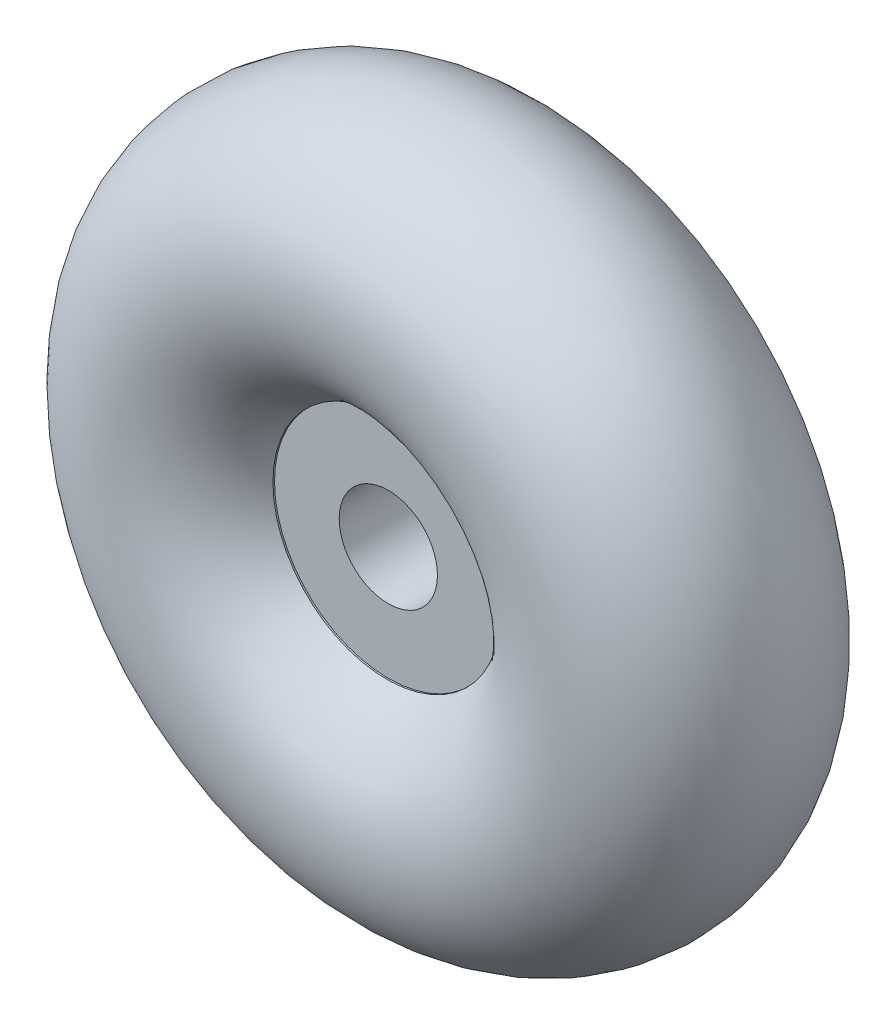
ISO-10303-21;
HEADER;
FILE_DESCRIPTION(('STEP AP214'),'2;1');
FILE_NAME('part.step','',(''),(''),'','','');
FILE_SCHEMA(('AUTOMOTIVE_DESIGN { 1 0 10303 214 1 1 1 1 }'));
ENDSEC;
DATA;
#1=APPLICATION_CONTEXT('core data for automotive mechanical design processes');
#2=APPLICATION_PROTOCOL_DEFINITION('international standard','automotive_design',2000,#1);
#3=PRODUCT_CONTEXT('',#1,'mechanical');
#4=PRODUCT('Part','Part','',(#3));
#5=PRODUCT_RELATED_PRODUCT_CATEGORY('part','',(#4));
#6=PRODUCT_DEFINITION_FORMATION('','',#4);
#7=PRODUCT_DEFINITION_CONTEXT('part definition',#1,'design');
#8=PRODUCT_DEFINITION('design','',#6,#7);
#9=PRODUCT_DEFINITION_SHAPE('','',#8);
#10=(LENGTH_UNIT() NAMED_UNIT(*) SI_UNIT(.MILLI.,.METRE.));
#11=(NAMED_UNIT(*) PLANE_ANGLE_UNIT() SI_UNIT($,.RADIAN.));
#12=(NAMED_UNIT(*) SI_UNIT($,.STERADIAN.) SOLID_ANGLE_UNIT());
#13=UNCERTAINTY_MEASURE_WITH_UNIT(LENGTH_MEASURE(1.E-05),#10,'distance_accuracy_value','');
#14=(GEOMETRIC_REPRESENTATION_CONTEXT(3) GLOBAL_UNCERTAINTY_ASSIGNED_CONTEXT((#13)) GLOBAL_UNIT_ASSIGNED_CONTEXT((#10,
#11,#12)) REPRESENTATION_CONTEXT('',''));
#15=CARTESIAN_POINT('',(0.,0.,0.));
#16=DIRECTION('',(0.,0.,1.));
#17=DIRECTION('',(1.,0.,0.));
#18=AXIS2_PLACEMENT_3D('',#15,#16,#17);
#19=CARTESIAN_POINT('',(0.,0.,0.));
#20=DIRECTION('',(0.,0.,-1.));
#21=DIRECTION('',(-1.,0.,0.));
#22=AXIS2_PLACEMENT_3D('',#19,#20,#21);
#23=CYLINDRICAL_SURFACE('',#22,9.5);
#24=CARTESIAN_POINT('',(0.,0.,-0.132226218918615));
#25=DIRECTION('',(0.,0.,-1.));
#26=DIRECTION('',(-1.,0.,0.));
#27=AXIS2_PLACEMENT_3D('',#24,#25,#26);
#28=CIRCLE('',#27,9.5);
#29=CARTESIAN_POINT('',(-9.5,0.,-0.132226218918615));
#30=VERTEX_POINT('',#29);
#31=EDGE_CURVE('E49',#30,#30,#28,.T.);
#32=ORIENTED_EDGE('',*,*,#31,.T.);
#33=EDGE_LOOP('',(#32));
#34=FACE_BOUND('',#33,.T.);
#35=CARTESIAN_POINT('',(0.,0.,0.));
#36=DIRECTION('',(0.,0.,1.));
#37=DIRECTION('',(1.,0.,0.));
#38=AXIS2_PLACEMENT_3D('',#35,#36,#37);
#39=CIRCLE('',#38,9.5);
#40=CARTESIAN_POINT('',(9.5,0.,0.));
#41=VERTEX_POINT('',#40);
#42=EDGE_CURVE('E10',#41,#41,#39,.T.);
#43=ORIENTED_EDGE('',*,*,#42,.T.);
#44=EDGE_LOOP('',(#43));
#45=FACE_BOUND('',#44,.T.);
#46=ADVANCED_FACE('F32',(#34,#45),#23,.F.);
#47=CARTESIAN_POINT('',(0.,0.,10.));
#48=DIRECTION('',(0.,0.,1.));
#49=DIRECTION('',(1.,0.,0.));
#50=AXIS2_PLACEMENT_3D('',#47,#48,#49);
#51=CIRCLE('',#50,9.5);
#52=CARTESIAN_POINT('',(9.5,0.,10.));
#53=VERTEX_POINT('',#52);
#54=EDGE_CURVE('E40',#53,#53,#51,.T.);
#55=ORIENTED_EDGE('',*,*,#54,.F.);
#56=EDGE_LOOP('',(#55));
#57=FACE_BOUND('',#56,.T.);
#58=CARTESIAN_POINT('',(0.,0.,10.1322262189186));
#59=DIRECTION('',(0.,0.,-1.));
#60=DIRECTION('',(-1.,0.,0.));
#61=AXIS2_PLACEMENT_3D('',#58,#59,#60);
#62=CIRCLE('',#61,9.5);
#63=CARTESIAN_POINT('',(-9.5,0.,10.1322262189186));
#64=VERTEX_POINT('',#63);
#65=EDGE_CURVE('E44',#64,#64,#62,.T.);
#66=ORIENTED_EDGE('',*,*,#65,.F.);
#67=EDGE_LOOP('',(#66));
#68=FACE_BOUND('',#67,.T.);
#69=ADVANCED_FACE('F72',(#57,#68),#23,.F.);
#70=CARTESIAN_POINT('',(0.,0.,5.));
#71=DIRECTION('',(0.,0.,-1.));
#72=DIRECTION('',(-1.,0.,0.));
#73=AXIS2_PLACEMENT_3D('',#70,#71,#72);
#74=TOROIDAL_SURFACE('',#73,18.6602540378444,10.5);
#75=ORIENTED_EDGE('',*,*,#31,.F.);
#76=EDGE_LOOP('',(#75));
#77=FACE_BOUND('',#76,.T.);
#78=ORIENTED_EDGE('',*,*,#65,.T.);
#79=EDGE_LOOP('',(#78));
#80=FACE_BOUND('',#79,.T.);
#81=ADVANCED_FACE('F75',(#77,#80),#74,.T.);
#82=CARTESIAN_POINT('',(0.,0.,0.));
#83=DIRECTION('',(0.,0.,1.));
#84=DIRECTION('',(1.,0.,0.));
#85=AXIS2_PLACEMENT_3D('',#82,#83,#84);
#86=PLANE('',#85);
#87=CARTESIAN_POINT('',(0.,0.,0.));
#88=DIRECTION('',(0.,0.,-1.));
#89=DIRECTION('',(-1.,0.,0.));
#90=AXIS2_PLACEMENT_3D('',#87,#88,#89);
#91=CIRCLE('',#90,4.1);
#92=CARTESIAN_POINT('',(-4.1,0.,0.));
#93=VERTEX_POINT('',#92);
#94=EDGE_CURVE('E58',#93,#93,#91,.T.);
#95=ORIENTED_EDGE('',*,*,#94,.F.);
#96=EDGE_LOOP('',(#95));
#97=FACE_BOUND('',#96,.T.);
#98=ORIENTED_EDGE('',*,*,#42,.F.);
#99=EDGE_LOOP('',(#98));
#100=FACE_BOUND('',#99,.T.);
#101=ADVANCED_FACE('F34',(#97,#100),#86,.F.);
#102=CARTESIAN_POINT('',(0.,0.,10.));
#103=DIRECTION('',(0.,0.,1.));
#104=DIRECTION('',(1.,0.,0.));
#105=AXIS2_PLACEMENT_3D('',#102,#103,#104);
#106=PLANE('',#105);
#107=CARTESIAN_POINT('',(0.,0.,10.));
#108=DIRECTION('',(0.,0.,1.));
#109=DIRECTION('',(1.,0.,0.));
#110=AXIS2_PLACEMENT_3D('',#107,#108,#109);
#111=CIRCLE('',#110,4.1);
#112=CARTESIAN_POINT('',(4.1,0.,10.));
#113=VERTEX_POINT('',#112);
#114=EDGE_CURVE('E36',#113,#113,#111,.T.);
#115=ORIENTED_EDGE('',*,*,#114,.F.);
#116=EDGE_LOOP('',(#115));
#117=FACE_BOUND('',#116,.T.);
#118=ORIENTED_EDGE('',*,*,#54,.T.);
#119=EDGE_LOOP('',(#118));
#120=FACE_BOUND('',#119,.T.);
#121=ADVANCED_FACE('F67',(#117,#120),#106,.T.);
#122=CARTESIAN_POINT('',(0.,0.,15.5));
#123=DIRECTION('',(0.,0.,-1.));
#124=DIRECTION('',(-1.,0.,0.));
#125=AXIS2_PLACEMENT_3D('',#122,#123,#124);
#126=CYLINDRICAL_SURFACE('',#125,4.1);
#127=ORIENTED_EDGE('',*,*,#114,.T.);
#128=EDGE_LOOP('',(#127));
#129=FACE_BOUND('',#128,.T.);
#130=ORIENTED_EDGE('',*,*,#94,.T.);
#131=EDGE_LOOP('',(#130));
#132=FACE_BOUND('',#131,.T.);
#133=ADVANCED_FACE('F65',(#129,#132),#126,.F.);
#134=CLOSED_SHELL('',(#46,#69,#81,#101,#121,#133));
#135=CARTESIAN_POINT('',(0.,0.,0.));
#136=DIRECTION('',(0.,0.,-1.));
#137=DIRECTION('',(-1.,0.,0.));
#138=AXIS2_PLACEMENT_3D('',#135,#136,#137);
#139=CYLINDRICAL_SURFACE('',#138,10.5);
#140=CARTESIAN_POINT('',(0.,0.,9.86418071599364));
#141=DIRECTION('',(0.,0.,-1.));
#142=DIRECTION('',(-1.,0.,0.));
#143=AXIS2_PLACEMENT_3D('',#140,#141,#142);
#144=CIRCLE('',#143,10.5);
#145=CARTESIAN_POINT('',(-10.5,0.,9.86418071599364));
#146=VERTEX_POINT('',#145);
#147=EDGE_CURVE('E52',#146,#146,#144,.T.);
#148=ORIENTED_EDGE('',*,*,#147,.T.);
#149=EDGE_LOOP('',(#148));
#150=FACE_BOUND('',#149,.T.);
#151=CARTESIAN_POINT('',(0.,0.,0.135819284006356));
#152=DIRECTION('',(0.,0.,-1.));
#153=DIRECTION('',(-1.,0.,0.));
#154=AXIS2_PLACEMENT_3D('',#151,#152,#153);
#155=CIRCLE('',#154,10.5);
#156=CARTESIAN_POINT('',(-10.5,0.,0.135819284006356));
#157=VERTEX_POINT('',#156);
#158=EDGE_CURVE('E55',#157,#157,#155,.T.);
#159=ORIENTED_EDGE('',*,*,#158,.F.);
#160=EDGE_LOOP('',(#159));
#161=FACE_BOUND('',#160,.T.);
#162=ADVANCED_FACE('F106',(#150,#161),#139,.T.);
#163=CARTESIAN_POINT('',(0.,0.,5.));
#164=DIRECTION('',(0.,0.,-1.));
#165=DIRECTION('',(-1.,0.,0.));
#166=AXIS2_PLACEMENT_3D('',#163,#164,#165);
#167=TOROIDAL_SURFACE('',#166,18.6602540378444,9.5);
#168=ORIENTED_EDGE('',*,*,#158,.T.);
#169=EDGE_LOOP('',(#168));
#170=FACE_BOUND('',#169,.T.);
#171=ORIENTED_EDGE('',*,*,#147,.F.);
#172=EDGE_LOOP('',(#171));
#173=FACE_BOUND('',#172,.T.);
#174=ADVANCED_FACE('F110',(#170,#173),#167,.F.);
#175=CLOSED_SHELL('',(#162,#174));
#176=ORIENTED_CLOSED_SHELL('',*,#175,.T.);
#177=BREP_WITH_VOIDS('B2',#134,(#176));
#178=ADVANCED_BREP_SHAPE_REPRESENTATION('',(#18,#177),#14);
#179=SHAPE_DEFINITION_REPRESENTATION(#9,#178);
ENDSEC;
END-ISO-10303-21;
